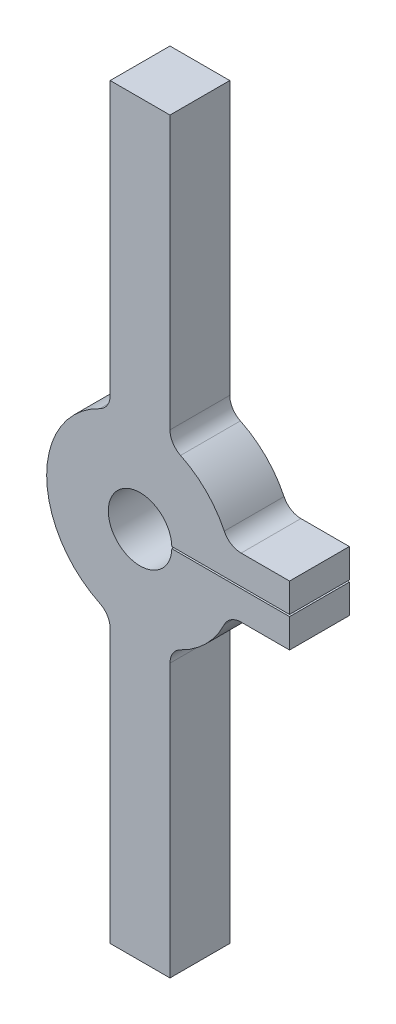
ISO-10303-21;
HEADER;
FILE_DESCRIPTION(('STEP AP214'),'2;1');
FILE_NAME('part.step','',(''),(''),'','','');
FILE_SCHEMA(('AUTOMOTIVE_DESIGN { 1 0 10303 214 1 1 1 1 }'));
ENDSEC;
DATA;
#1=APPLICATION_CONTEXT('core data for automotive mechanical design processes');
#2=APPLICATION_PROTOCOL_DEFINITION('international standard','automotive_design',2000,#1);
#3=PRODUCT_CONTEXT('',#1,'mechanical');
#4=PRODUCT('Part','Part','',(#3));
#5=PRODUCT_RELATED_PRODUCT_CATEGORY('part','',(#4));
#6=PRODUCT_DEFINITION_FORMATION('','',#4);
#7=PRODUCT_DEFINITION_CONTEXT('part definition',#1,'design');
#8=PRODUCT_DEFINITION('design','',#6,#7);
#9=PRODUCT_DEFINITION_SHAPE('','',#8);
#10=(LENGTH_UNIT() NAMED_UNIT(*) SI_UNIT(.MILLI.,.METRE.));
#11=(NAMED_UNIT(*) PLANE_ANGLE_UNIT() SI_UNIT($,.RADIAN.));
#12=(NAMED_UNIT(*) SI_UNIT($,.STERADIAN.) SOLID_ANGLE_UNIT());
#13=UNCERTAINTY_MEASURE_WITH_UNIT(LENGTH_MEASURE(1.E-05),#10,'distance_accuracy_value','');
#14=(GEOMETRIC_REPRESENTATION_CONTEXT(3) GLOBAL_UNCERTAINTY_ASSIGNED_CONTEXT((#13)) GLOBAL_UNIT_ASSIGNED_CONTEXT((#10,
#11,#12)) REPRESENTATION_CONTEXT('',''));
#15=CARTESIAN_POINT('',(0.,0.,0.));
#16=DIRECTION('',(0.,0.,1.));
#17=DIRECTION('',(1.,0.,0.));
#18=AXIS2_PLACEMENT_3D('',#15,#16,#17);
#19=CARTESIAN_POINT('',(40.,-8.,8.));
#20=DIRECTION('',(-1.,0.,0.));
#21=DIRECTION('',(0.,0.,1.));
#22=AXIS2_PLACEMENT_3D('',#19,#20,#21);
#23=PLANE('',#22);
#24=DIRECTION('',(0.,1.,0.));
#25=VECTOR('',#24,1.);
#26=CARTESIAN_POINT('',(40.,-8.,8.));
#27=LINE('',#26,#25);
#28=CARTESIAN_POINT('',(40.,0.25,8.));
#29=VERTEX_POINT('',#28);
#30=CARTESIAN_POINT('',(40.,8.,8.));
#31=VERTEX_POINT('',#30);
#32=EDGE_CURVE('E195',#29,#31,#27,.T.);
#33=ORIENTED_EDGE('',*,*,#32,.F.);
#34=DIRECTION('',(0.,0.,-1.));
#35=VECTOR('',#34,1.);
#36=CARTESIAN_POINT('',(40.,0.25,8.));
#37=LINE('',#36,#35);
#38=CARTESIAN_POINT('',(40.,0.25,-8.));
#39=VERTEX_POINT('',#38);
#40=EDGE_CURVE('E179',#29,#39,#37,.T.);
#41=ORIENTED_EDGE('',*,*,#40,.T.);
#42=DIRECTION('',(0.,1.,0.));
#43=VECTOR('',#42,1.);
#44=CARTESIAN_POINT('',(40.,-8.,-8.));
#45=LINE('',#44,#43);
#46=CARTESIAN_POINT('',(40.,8.,-8.));
#47=VERTEX_POINT('',#46);
#48=EDGE_CURVE('E217',#39,#47,#45,.T.);
#49=ORIENTED_EDGE('',*,*,#48,.T.);
#50=DIRECTION('',(0.,0.,-1.));
#51=VECTOR('',#50,1.);
#52=CARTESIAN_POINT('',(40.,8.,8.));
#53=LINE('',#52,#51);
#54=EDGE_CURVE('E203',#31,#47,#53,.T.);
#55=ORIENTED_EDGE('',*,*,#54,.F.);
#56=EDGE_LOOP('',(#33,#41,#49,#55));
#57=FACE_BOUND('',#56,.T.);
#58=ADVANCED_FACE('F32',(#57),#23,.F.);
#59=CARTESIAN_POINT('',(0.,0.,8.));
#60=DIRECTION('',(0.,0.,-1.));
#61=DIRECTION('',(-1.,0.,0.));
#62=AXIS2_PLACEMENT_3D('',#59,#60,#61);
#63=CYLINDRICAL_SURFACE('',#62,25.);
#64=CARTESIAN_POINT('',(0.,0.,-8.));
#65=DIRECTION('',(0.,0.,1.));
#66=DIRECTION('',(1.,0.,0.));
#67=AXIS2_PLACEMENT_3D('',#64,#65,#66);
#68=CIRCLE('',#67,25.);
#69=CARTESIAN_POINT('',(10.8333333333333,-22.5308430576596,-8.));
#70=VERTEX_POINT('',#69);
#71=CARTESIAN_POINT('',(22.5308430576596,-10.8333333333333,-8.));
#72=VERTEX_POINT('',#71);
#73=EDGE_CURVE('E280',#70,#72,#68,.T.);
#74=ORIENTED_EDGE('',*,*,#73,.T.);
#75=DIRECTION('',(0.,0.,-1.));
#76=VECTOR('',#75,1.);
#77=CARTESIAN_POINT('',(22.5308430576596,-10.8333333333333,8.));
#78=LINE('',#77,#76);
#79=CARTESIAN_POINT('',(22.5308430576596,-10.8333333333333,8.));
#80=VERTEX_POINT('',#79);
#81=EDGE_CURVE('E288',#72,#80,#78,.F.);
#82=ORIENTED_EDGE('',*,*,#81,.T.);
#83=CARTESIAN_POINT('',(0.,0.,8.));
#84=DIRECTION('',(0.,0.,1.));
#85=DIRECTION('',(1.,0.,0.));
#86=AXIS2_PLACEMENT_3D('',#83,#84,#85);
#87=CIRCLE('',#86,25.);
#88=CARTESIAN_POINT('',(10.8333333333333,-22.5308430576596,8.));
#89=VERTEX_POINT('',#88);
#90=EDGE_CURVE('E275',#89,#80,#87,.T.);
#91=ORIENTED_EDGE('',*,*,#90,.F.);
#92=DIRECTION('',(0.,0.,-1.));
#93=VECTOR('',#92,1.);
#94=CARTESIAN_POINT('',(10.8333333333333,-22.5308430576596,8.));
#95=LINE('',#94,#93);
#96=EDGE_CURVE('E285',#89,#70,#95,.T.);
#97=ORIENTED_EDGE('',*,*,#96,.T.);
#98=EDGE_LOOP('',(#74,#82,#91,#97));
#99=FACE_BOUND('',#98,.T.);
#100=ADVANCED_FACE('F367',(#99),#63,.T.);
#101=CARTESIAN_POINT('',(22.5308430576596,10.8333333333333,8.));
#102=VERTEX_POINT('',#101);
#103=CARTESIAN_POINT('',(10.8333333333333,22.5308430576596,8.));
#104=VERTEX_POINT('',#103);
#105=EDGE_CURVE('E273',#102,#104,#87,.T.);
#106=ORIENTED_EDGE('',*,*,#105,.F.);
#107=DIRECTION('',(0.,0.,-1.));
#108=VECTOR('',#107,1.);
#109=CARTESIAN_POINT('',(22.5308430576596,10.8333333333333,8.));
#110=LINE('',#109,#108);
#111=CARTESIAN_POINT('',(22.5308430576596,10.8333333333333,-8.));
#112=VERTEX_POINT('',#111);
#113=EDGE_CURVE('E304',#102,#112,#110,.T.);
#114=ORIENTED_EDGE('',*,*,#113,.T.);
#115=CARTESIAN_POINT('',(10.8333333333333,22.5308430576596,-8.));
#116=VERTEX_POINT('',#115);
#117=EDGE_CURVE('E270',#112,#116,#68,.T.);
#118=ORIENTED_EDGE('',*,*,#117,.T.);
#119=DIRECTION('',(0.,0.,-1.));
#120=VECTOR('',#119,1.);
#121=CARTESIAN_POINT('',(10.8333333333333,22.5308430576596,8.));
#122=LINE('',#121,#120);
#123=EDGE_CURVE('E302',#116,#104,#122,.F.);
#124=ORIENTED_EDGE('',*,*,#123,.T.);
#125=EDGE_LOOP('',(#106,#114,#118,#124));
#126=FACE_BOUND('',#125,.T.);
#127=ADVANCED_FACE('F337',(#126),#63,.T.);
#128=CARTESIAN_POINT('',(-10.8333333333333,22.5308430576596,-8.));
#129=VERTEX_POINT('',#128);
#130=CARTESIAN_POINT('',(-10.8333333333333,-22.5308430576596,-8.));
#131=VERTEX_POINT('',#130);
#132=EDGE_CURVE('E276',#129,#131,#68,.T.);
#133=ORIENTED_EDGE('',*,*,#132,.T.);
#134=DIRECTION('',(0.,0.,-1.));
#135=VECTOR('',#134,1.);
#136=CARTESIAN_POINT('',(-10.8333333333333,-22.5308430576596,8.));
#137=LINE('',#136,#135);
#138=CARTESIAN_POINT('',(-10.8333333333333,-22.5308430576596,8.));
#139=VERTEX_POINT('',#138);
#140=EDGE_CURVE('E296',#131,#139,#137,.F.);
#141=ORIENTED_EDGE('',*,*,#140,.T.);
#142=CARTESIAN_POINT('',(-10.8333333333333,22.5308430576596,8.));
#143=VERTEX_POINT('',#142);
#144=EDGE_CURVE('E277',#143,#139,#87,.T.);
#145=ORIENTED_EDGE('',*,*,#144,.F.);
#146=DIRECTION('',(0.,0.,-1.));
#147=VECTOR('',#146,1.);
#148=CARTESIAN_POINT('',(-10.8333333333333,22.5308430576596,8.));
#149=LINE('',#148,#147);
#150=EDGE_CURVE('E293',#143,#129,#149,.T.);
#151=ORIENTED_EDGE('',*,*,#150,.T.);
#152=EDGE_LOOP('',(#133,#141,#145,#151));
#153=FACE_BOUND('',#152,.T.);
#154=ADVANCED_FACE('F360',(#153),#63,.T.);
#155=CARTESIAN_POINT('',(0.,0.,8.));
#156=DIRECTION('',(0.,0.,1.));
#157=DIRECTION('',(1.,0.,0.));
#158=AXIS2_PLACEMENT_3D('',#155,#156,#157);
#159=PLANE('',#158);
#160=DIRECTION('',(-1.,0.,0.));
#161=VECTOR('',#160,1.);
#162=CARTESIAN_POINT('',(2.,0.25,8.));
#163=LINE('',#162,#161);
#164=CARTESIAN_POINT('',(8.49632273398321,0.25,8.));
#165=VERTEX_POINT('',#164);
#166=EDGE_CURVE('E182',#29,#165,#163,.T.);
#167=ORIENTED_EDGE('',*,*,#166,.F.);
#168=ORIENTED_EDGE('',*,*,#32,.T.);
#169=DIRECTION('',(-1.,0.,0.));
#170=VECTOR('',#169,1.);
#171=CARTESIAN_POINT('',(40.,8.,8.));
#172=LINE('',#171,#170);
#173=CARTESIAN_POINT('',(27.0370116691916,8.,8.));
#174=VERTEX_POINT('',#173);
#175=EDGE_CURVE('E209',#31,#174,#172,.T.);
#176=ORIENTED_EDGE('',*,*,#175,.T.);
#177=CARTESIAN_POINT('',(27.0370116691916,13.,8.));
#178=DIRECTION('',(0.,0.,1.));
#179=DIRECTION('',(1.,0.,0.));
#180=AXIS2_PLACEMENT_3D('',#177,#178,#179);
#181=CIRCLE('',#180,5.);
#182=EDGE_CURVE('E329',#174,#102,#181,.F.);
#183=ORIENTED_EDGE('',*,*,#182,.T.);
#184=ORIENTED_EDGE('',*,*,#105,.T.);
#185=CARTESIAN_POINT('',(13.,27.0370116691916,8.));
#186=DIRECTION('',(0.,0.,1.));
#187=DIRECTION('',(1.,0.,0.));
#188=AXIS2_PLACEMENT_3D('',#185,#186,#187);
#189=CIRCLE('',#188,5.);
#190=CARTESIAN_POINT('',(7.99999999999999,27.0370116691916,8.));
#191=VERTEX_POINT('',#190);
#192=EDGE_CURVE('E11',#104,#191,#189,.F.);
#193=ORIENTED_EDGE('',*,*,#192,.T.);
#194=DIRECTION('',(0.,1.,0.));
#195=VECTOR('',#194,1.);
#196=CARTESIAN_POINT('',(8.,100.,8.));
#197=LINE('',#196,#195);
#198=CARTESIAN_POINT('',(8.,100.,8.));
#199=VERTEX_POINT('',#198);
#200=EDGE_CURVE('E249',#191,#199,#197,.T.);
#201=ORIENTED_EDGE('',*,*,#200,.T.);
#202=DIRECTION('',(-1.,0.,0.));
#203=VECTOR('',#202,1.);
#204=CARTESIAN_POINT('',(-8.,100.,8.));
#205=LINE('',#204,#203);
#206=CARTESIAN_POINT('',(-8.,100.,8.));
#207=VERTEX_POINT('',#206);
#208=EDGE_CURVE('E251',#199,#207,#205,.T.);
#209=ORIENTED_EDGE('',*,*,#208,.T.);
#210=DIRECTION('',(0.,-1.,0.));
#211=VECTOR('',#210,1.);
#212=CARTESIAN_POINT('',(-8.,100.,8.));
#213=LINE('',#212,#211);
#214=CARTESIAN_POINT('',(-7.99999999999999,27.0370116691916,8.));
#215=VERTEX_POINT('',#214);
#216=EDGE_CURVE('E254',#207,#215,#213,.T.);
#217=ORIENTED_EDGE('',*,*,#216,.T.);
#218=CARTESIAN_POINT('',(-13.,27.0370116691916,8.));
#219=DIRECTION('',(0.,0.,1.));
#220=DIRECTION('',(1.,0.,0.));
#221=AXIS2_PLACEMENT_3D('',#218,#219,#220);
#222=CIRCLE('',#221,5.);
#223=EDGE_CURVE('E321',#215,#143,#222,.F.);
#224=ORIENTED_EDGE('',*,*,#223,.T.);
#225=ORIENTED_EDGE('',*,*,#144,.T.);
#226=CARTESIAN_POINT('',(-13.,-27.0370116691916,8.));
#227=DIRECTION('',(0.,0.,1.));
#228=DIRECTION('',(1.,0.,0.));
#229=AXIS2_PLACEMENT_3D('',#226,#227,#228);
#230=CIRCLE('',#229,5.);
#231=CARTESIAN_POINT('',(-8.,-27.0370116691916,8.));
#232=VERTEX_POINT('',#231);
#233=EDGE_CURVE('E317',#139,#232,#230,.F.);
#234=ORIENTED_EDGE('',*,*,#233,.T.);
#235=DIRECTION('',(0.,-1.,0.));
#236=VECTOR('',#235,1.);
#237=CARTESIAN_POINT('',(-7.99999999999999,-100.,8.));
#238=LINE('',#237,#236);
#239=CARTESIAN_POINT('',(-7.99999999999999,-100.,8.));
#240=VERTEX_POINT('',#239);
#241=EDGE_CURVE('E232',#232,#240,#238,.T.);
#242=ORIENTED_EDGE('',*,*,#241,.T.);
#243=DIRECTION('',(1.,0.,0.));
#244=VECTOR('',#243,1.);
#245=CARTESIAN_POINT('',(-7.99999999999999,-100.,8.));
#246=LINE('',#245,#244);
#247=CARTESIAN_POINT('',(8.00000000000001,-100.,8.));
#248=VERTEX_POINT('',#247);
#249=EDGE_CURVE('E235',#240,#248,#246,.T.);
#250=ORIENTED_EDGE('',*,*,#249,.T.);
#251=DIRECTION('',(0.,1.,0.));
#252=VECTOR('',#251,1.);
#253=CARTESIAN_POINT('',(8.00000000000001,-100.,8.));
#254=LINE('',#253,#252);
#255=CARTESIAN_POINT('',(8.00000000000001,-27.0370116691915,8.));
#256=VERTEX_POINT('',#255);
#257=EDGE_CURVE('E229',#248,#256,#254,.T.);
#258=ORIENTED_EDGE('',*,*,#257,.T.);
#259=CARTESIAN_POINT('',(13.,-27.0370116691916,8.));
#260=DIRECTION('',(0.,0.,1.));
#261=DIRECTION('',(1.,0.,0.));
#262=AXIS2_PLACEMENT_3D('',#259,#260,#261);
#263=CIRCLE('',#262,5.);
#264=EDGE_CURVE('E325',#256,#89,#263,.F.);
#265=ORIENTED_EDGE('',*,*,#264,.T.);
#266=ORIENTED_EDGE('',*,*,#90,.T.);
#267=CARTESIAN_POINT('',(27.0370116691916,-13.,8.));
#268=DIRECTION('',(0.,0.,1.));
#269=DIRECTION('',(1.,0.,0.));
#270=AXIS2_PLACEMENT_3D('',#267,#268,#269);
#271=CIRCLE('',#270,5.);
#272=CARTESIAN_POINT('',(27.0370116691916,-8.,8.));
#273=VERTEX_POINT('',#272);
#274=EDGE_CURVE('E313',#80,#273,#271,.F.);
#275=ORIENTED_EDGE('',*,*,#274,.T.);
#276=DIRECTION('',(1.,0.,0.));
#277=VECTOR('',#276,1.);
#278=CARTESIAN_POINT('',(40.,-8.,8.));
#279=LINE('',#278,#277);
#280=CARTESIAN_POINT('',(40.,-8.,8.));
#281=VERTEX_POINT('',#280);
#282=EDGE_CURVE('E206',#273,#281,#279,.T.);
#283=ORIENTED_EDGE('',*,*,#282,.T.);
#284=CARTESIAN_POINT('',(40.,-0.25,8.));
#285=VERTEX_POINT('',#284);
#286=EDGE_CURVE('E205',#281,#285,#27,.T.);
#287=ORIENTED_EDGE('',*,*,#286,.T.);
#288=DIRECTION('',(1.,0.,0.));
#289=VECTOR('',#288,1.);
#290=CARTESIAN_POINT('',(2.,-0.25,8.));
#291=LINE('',#290,#289);
#292=CARTESIAN_POINT('',(8.49632273398321,-0.25,8.));
#293=VERTEX_POINT('',#292);
#294=EDGE_CURVE('E200',#293,#285,#291,.T.);
#295=ORIENTED_EDGE('',*,*,#294,.F.);
#296=CARTESIAN_POINT('',(0.,0.,8.));
#297=DIRECTION('',(0.,0.,1.));
#298=DIRECTION('',(1.,0.,0.));
#299=AXIS2_PLACEMENT_3D('',#296,#297,#298);
#300=CIRCLE('',#299,8.5);
#301=EDGE_CURVE('E199',#165,#293,#300,.T.);
#302=ORIENTED_EDGE('',*,*,#301,.F.);
#303=EDGE_LOOP('',(#167,#168,#176,#183,#184,#193,#201,#209,#217,#224,#225,#234,#242,#250,#258,
#265,#266,#275,#283,#287,#295,#302));
#304=FACE_BOUND('',#303,.T.);
#305=ADVANCED_FACE('F193',(#304),#159,.T.);
#306=CARTESIAN_POINT('',(0.,0.,-8.));
#307=DIRECTION('',(0.,0.,1.));
#308=DIRECTION('',(1.,0.,0.));
#309=AXIS2_PLACEMENT_3D('',#306,#307,#308);
#310=PLANE('',#309);
#311=ORIENTED_EDGE('',*,*,#48,.F.);
#312=DIRECTION('',(-1.,0.,0.));
#313=VECTOR('',#312,1.);
#314=CARTESIAN_POINT('',(2.,0.25,-8.));
#315=LINE('',#314,#313);
#316=CARTESIAN_POINT('',(8.49632273398321,0.25,-8.));
#317=VERTEX_POINT('',#316);
#318=EDGE_CURVE('E185',#39,#317,#315,.T.);
#319=ORIENTED_EDGE('',*,*,#318,.T.);
#320=CARTESIAN_POINT('',(0.,0.,-8.));
#321=DIRECTION('',(0.,0.,1.));
#322=DIRECTION('',(1.,0.,0.));
#323=AXIS2_PLACEMENT_3D('',#320,#321,#322);
#324=CIRCLE('',#323,8.5);
#325=CARTESIAN_POINT('',(8.49632273398321,-0.25,-8.));
#326=VERTEX_POINT('',#325);
#327=EDGE_CURVE('E268',#317,#326,#324,.T.);
#328=ORIENTED_EDGE('',*,*,#327,.T.);
#329=DIRECTION('',(1.,0.,0.));
#330=VECTOR('',#329,1.);
#331=CARTESIAN_POINT('',(2.,-0.25,-8.));
#332=LINE('',#331,#330);
#333=CARTESIAN_POINT('',(40.,-0.25,-8.));
#334=VERTEX_POINT('',#333);
#335=EDGE_CURVE('E391',#326,#334,#332,.T.);
#336=ORIENTED_EDGE('',*,*,#335,.T.);
#337=CARTESIAN_POINT('',(40.,-8.,-8.));
#338=VERTEX_POINT('',#337);
#339=EDGE_CURVE('E219',#338,#334,#45,.T.);
#340=ORIENTED_EDGE('',*,*,#339,.F.);
#341=DIRECTION('',(1.,0.,0.));
#342=VECTOR('',#341,1.);
#343=CARTESIAN_POINT('',(40.,-8.,-8.));
#344=LINE('',#343,#342);
#345=CARTESIAN_POINT('',(27.0370116691916,-8.,-8.));
#346=VERTEX_POINT('',#345);
#347=EDGE_CURVE('E215',#346,#338,#344,.T.);
#348=ORIENTED_EDGE('',*,*,#347,.F.);
#349=CARTESIAN_POINT('',(27.0370116691916,-13.,-8.));
#350=DIRECTION('',(0.,0.,1.));
#351=DIRECTION('',(1.,0.,0.));
#352=AXIS2_PLACEMENT_3D('',#349,#350,#351);
#353=CIRCLE('',#352,5.);
#354=EDGE_CURVE('E311',#346,#72,#353,.T.);
#355=ORIENTED_EDGE('',*,*,#354,.T.);
#356=ORIENTED_EDGE('',*,*,#73,.F.);
#357=CARTESIAN_POINT('',(13.,-27.0370116691916,-8.));
#358=DIRECTION('',(0.,0.,1.));
#359=DIRECTION('',(1.,0.,0.));
#360=AXIS2_PLACEMENT_3D('',#357,#358,#359);
#361=CIRCLE('',#360,5.);
#362=CARTESIAN_POINT('',(8.00000000000001,-27.0370116691915,-8.));
#363=VERTEX_POINT('',#362);
#364=EDGE_CURVE('E323',#70,#363,#361,.T.);
#365=ORIENTED_EDGE('',*,*,#364,.T.);
#366=DIRECTION('',(0.,1.,0.));
#367=VECTOR('',#366,1.);
#368=CARTESIAN_POINT('',(8.00000000000001,-100.,-8.));
#369=LINE('',#368,#367);
#370=CARTESIAN_POINT('',(8.00000000000001,-100.,-8.));
#371=VERTEX_POINT('',#370);
#372=EDGE_CURVE('E228',#371,#363,#369,.T.);
#373=ORIENTED_EDGE('',*,*,#372,.F.);
#374=DIRECTION('',(1.,0.,0.));
#375=VECTOR('',#374,1.);
#376=CARTESIAN_POINT('',(-7.99999999999999,-100.,-8.));
#377=LINE('',#376,#375);
#378=CARTESIAN_POINT('',(-7.99999999999999,-100.,-8.));
#379=VERTEX_POINT('',#378);
#380=EDGE_CURVE('E233',#379,#371,#377,.T.);
#381=ORIENTED_EDGE('',*,*,#380,.F.);
#382=DIRECTION('',(0.,-1.,0.));
#383=VECTOR('',#382,1.);
#384=CARTESIAN_POINT('',(-7.99999999999999,-100.,-8.));
#385=LINE('',#384,#383);
#386=CARTESIAN_POINT('',(-8.,-27.0370116691916,-8.));
#387=VERTEX_POINT('',#386);
#388=EDGE_CURVE('E240',#387,#379,#385,.T.);
#389=ORIENTED_EDGE('',*,*,#388,.F.);
#390=CARTESIAN_POINT('',(-13.,-27.0370116691916,-8.));
#391=DIRECTION('',(0.,0.,1.));
#392=DIRECTION('',(1.,0.,0.));
#393=AXIS2_PLACEMENT_3D('',#390,#391,#392);
#394=CIRCLE('',#393,5.);
#395=EDGE_CURVE('E315',#387,#131,#394,.T.);
#396=ORIENTED_EDGE('',*,*,#395,.T.);
#397=ORIENTED_EDGE('',*,*,#132,.F.);
#398=CARTESIAN_POINT('',(-13.,27.0370116691916,-8.));
#399=DIRECTION('',(0.,0.,1.));
#400=DIRECTION('',(1.,0.,0.));
#401=AXIS2_PLACEMENT_3D('',#398,#399,#400);
#402=CIRCLE('',#401,5.);
#403=CARTESIAN_POINT('',(-7.99999999999999,27.0370116691916,-8.));
#404=VERTEX_POINT('',#403);
#405=EDGE_CURVE('E319',#129,#404,#402,.T.);
#406=ORIENTED_EDGE('',*,*,#405,.T.);
#407=DIRECTION('',(0.,-1.,0.));
#408=VECTOR('',#407,1.);
#409=CARTESIAN_POINT('',(-8.,100.,-8.));
#410=LINE('',#409,#408);
#411=CARTESIAN_POINT('',(-8.,100.,-8.));
#412=VERTEX_POINT('',#411);
#413=EDGE_CURVE('E252',#412,#404,#410,.T.);
#414=ORIENTED_EDGE('',*,*,#413,.F.);
#415=DIRECTION('',(-1.,0.,0.));
#416=VECTOR('',#415,1.);
#417=CARTESIAN_POINT('',(-8.,100.,-8.));
#418=LINE('',#417,#416);
#419=CARTESIAN_POINT('',(8.,100.,-8.));
#420=VERTEX_POINT('',#419);
#421=EDGE_CURVE('E259',#420,#412,#418,.T.);
#422=ORIENTED_EDGE('',*,*,#421,.F.);
#423=DIRECTION('',(0.,1.,0.));
#424=VECTOR('',#423,1.);
#425=CARTESIAN_POINT('',(8.,100.,-8.));
#426=LINE('',#425,#424);
#427=CARTESIAN_POINT('',(7.99999999999999,27.0370116691916,-8.));
#428=VERTEX_POINT('',#427);
#429=EDGE_CURVE('E248',#428,#420,#426,.T.);
#430=ORIENTED_EDGE('',*,*,#429,.F.);
#431=CARTESIAN_POINT('',(13.,27.0370116691916,-8.));
#432=DIRECTION('',(0.,0.,1.));
#433=DIRECTION('',(1.,0.,0.));
#434=AXIS2_PLACEMENT_3D('',#431,#432,#433);
#435=CIRCLE('',#434,5.);
#436=EDGE_CURVE('E40',#428,#116,#435,.T.);
#437=ORIENTED_EDGE('',*,*,#436,.T.);
#438=ORIENTED_EDGE('',*,*,#117,.F.);
#439=CARTESIAN_POINT('',(27.0370116691916,13.,-8.));
#440=DIRECTION('',(0.,0.,1.));
#441=DIRECTION('',(1.,0.,0.));
#442=AXIS2_PLACEMENT_3D('',#439,#440,#441);
#443=CIRCLE('',#442,5.);
#444=CARTESIAN_POINT('',(27.0370116691916,8.,-8.));
#445=VERTEX_POINT('',#444);
#446=EDGE_CURVE('E327',#112,#445,#443,.T.);
#447=ORIENTED_EDGE('',*,*,#446,.T.);
#448=DIRECTION('',(-1.,0.,0.));
#449=VECTOR('',#448,1.);
#450=CARTESIAN_POINT('',(40.,8.,-8.));
#451=LINE('',#450,#449);
#452=EDGE_CURVE('E210',#47,#445,#451,.T.);
#453=ORIENTED_EDGE('',*,*,#452,.F.);
#454=EDGE_LOOP('',(#311,#319,#328,#336,#340,#348,#355,#356,#365,#373,#381,#389,#396,#397,#406,
#414,#422,#430,#437,#438,#447,#453));
#455=FACE_BOUND('',#454,.T.);
#456=ADVANCED_FACE('F333',(#455),#310,.F.);
#457=CARTESIAN_POINT('',(0.,0.,8.));
#458=DIRECTION('',(0.,0.,-1.));
#459=DIRECTION('',(-1.,0.,0.));
#460=AXIS2_PLACEMENT_3D('',#457,#458,#459);
#461=CYLINDRICAL_SURFACE('',#460,8.5);
#462=DIRECTION('',(0.,0.,-1.));
#463=VECTOR('',#462,1.);
#464=CARTESIAN_POINT('',(8.49632273398321,0.25,8.));
#465=LINE('',#464,#463);
#466=EDGE_CURVE('E218',#165,#317,#465,.T.);
#467=ORIENTED_EDGE('',*,*,#466,.F.);
#468=ORIENTED_EDGE('',*,*,#301,.T.);
#469=DIRECTION('',(0.,0.,-1.));
#470=VECTOR('',#469,1.);
#471=CARTESIAN_POINT('',(8.49632273398321,-0.25,8.));
#472=LINE('',#471,#470);
#473=EDGE_CURVE('E390',#326,#293,#472,.F.);
#474=ORIENTED_EDGE('',*,*,#473,.F.);
#475=ORIENTED_EDGE('',*,*,#327,.F.);
#476=EDGE_LOOP('',(#467,#468,#474,#475));
#477=FACE_BOUND('',#476,.T.);
#478=ADVANCED_FACE('F388',(#477),#461,.F.);
#479=CARTESIAN_POINT('',(8.,100.,8.));
#480=DIRECTION('',(-1.,0.,0.));
#481=DIRECTION('',(0.,-1.,0.));
#482=AXIS2_PLACEMENT_3D('',#479,#480,#481);
#483=PLANE('',#482);
#484=ORIENTED_EDGE('',*,*,#200,.F.);
#485=DIRECTION('',(0.,0.,1.));
#486=VECTOR('',#485,1.);
#487=CARTESIAN_POINT('',(7.99999999999999,27.0370116691916,-8.));
#488=LINE('',#487,#486);
#489=EDGE_CURVE('E309',#191,#428,#488,.F.);
#490=ORIENTED_EDGE('',*,*,#489,.T.);
#491=ORIENTED_EDGE('',*,*,#429,.T.);
#492=DIRECTION('',(0.,0.,-1.));
#493=VECTOR('',#492,1.);
#494=CARTESIAN_POINT('',(8.,100.,8.));
#495=LINE('',#494,#493);
#496=EDGE_CURVE('E265',#199,#420,#495,.T.);
#497=ORIENTED_EDGE('',*,*,#496,.F.);
#498=EDGE_LOOP('',(#484,#490,#491,#497));
#499=FACE_BOUND('',#498,.T.);
#500=ADVANCED_FACE('F340',(#499),#483,.F.);
#501=CARTESIAN_POINT('',(-8.,100.,8.));
#502=DIRECTION('',(0.,-1.,0.));
#503=DIRECTION('',(0.,0.,-1.));
#504=AXIS2_PLACEMENT_3D('',#501,#502,#503);
#505=PLANE('',#504);
#506=ORIENTED_EDGE('',*,*,#421,.T.);
#507=DIRECTION('',(0.,0.,-1.));
#508=VECTOR('',#507,1.);
#509=CARTESIAN_POINT('',(-8.,100.,8.));
#510=LINE('',#509,#508);
#511=EDGE_CURVE('E257',#207,#412,#510,.T.);
#512=ORIENTED_EDGE('',*,*,#511,.F.);
#513=ORIENTED_EDGE('',*,*,#208,.F.);
#514=ORIENTED_EDGE('',*,*,#496,.T.);
#515=EDGE_LOOP('',(#506,#512,#513,#514));
#516=FACE_BOUND('',#515,.T.);
#517=ADVANCED_FACE('F345',(#516),#505,.F.);
#518=CARTESIAN_POINT('',(-8.,100.,8.));
#519=DIRECTION('',(1.,0.,0.));
#520=DIRECTION('',(0.,1.,0.));
#521=AXIS2_PLACEMENT_3D('',#518,#519,#520);
#522=PLANE('',#521);
#523=ORIENTED_EDGE('',*,*,#413,.T.);
#524=DIRECTION('',(0.,0.,1.));
#525=VECTOR('',#524,1.);
#526=CARTESIAN_POINT('',(-7.99999999999999,27.0370116691916,8.));
#527=LINE('',#526,#525);
#528=EDGE_CURVE('E298',#404,#215,#527,.T.);
#529=ORIENTED_EDGE('',*,*,#528,.T.);
#530=ORIENTED_EDGE('',*,*,#216,.F.);
#531=ORIENTED_EDGE('',*,*,#511,.T.);
#532=EDGE_LOOP('',(#523,#529,#530,#531));
#533=FACE_BOUND('',#532,.T.);
#534=ADVANCED_FACE('F349',(#533),#522,.F.);
#535=CARTESIAN_POINT('',(8.00000000000001,-100.,8.));
#536=DIRECTION('',(-1.,0.,0.));
#537=DIRECTION('',(0.,-1.,0.));
#538=AXIS2_PLACEMENT_3D('',#535,#536,#537);
#539=PLANE('',#538);
#540=ORIENTED_EDGE('',*,*,#372,.T.);
#541=DIRECTION('',(0.,0.,1.));
#542=VECTOR('',#541,1.);
#543=CARTESIAN_POINT('',(8.00000000000001,-27.0370116691916,8.));
#544=LINE('',#543,#542);
#545=EDGE_CURVE('E300',#363,#256,#544,.T.);
#546=ORIENTED_EDGE('',*,*,#545,.T.);
#547=ORIENTED_EDGE('',*,*,#257,.F.);
#548=DIRECTION('',(0.,0.,-1.));
#549=VECTOR('',#548,1.);
#550=CARTESIAN_POINT('',(8.00000000000001,-100.,8.));
#551=LINE('',#550,#549);
#552=EDGE_CURVE('E237',#248,#371,#551,.T.);
#553=ORIENTED_EDGE('',*,*,#552,.T.);
#554=EDGE_LOOP('',(#540,#546,#547,#553));
#555=FACE_BOUND('',#554,.T.);
#556=ADVANCED_FACE('F435',(#555),#539,.F.);
#557=CARTESIAN_POINT('',(-7.99999999999999,-100.,8.));
#558=DIRECTION('',(1.,0.,0.));
#559=DIRECTION('',(0.,1.,0.));
#560=AXIS2_PLACEMENT_3D('',#557,#558,#559);
#561=PLANE('',#560);
#562=ORIENTED_EDGE('',*,*,#241,.F.);
#563=DIRECTION('',(0.,0.,1.));
#564=VECTOR('',#563,1.);
#565=CARTESIAN_POINT('',(-8.,-27.0370116691916,-8.));
#566=LINE('',#565,#564);
#567=EDGE_CURVE('E290',#232,#387,#566,.F.);
#568=ORIENTED_EDGE('',*,*,#567,.T.);
#569=ORIENTED_EDGE('',*,*,#388,.T.);
#570=DIRECTION('',(0.,0.,-1.));
#571=VECTOR('',#570,1.);
#572=CARTESIAN_POINT('',(-7.99999999999999,-100.,8.));
#573=LINE('',#572,#571);
#574=EDGE_CURVE('E245',#240,#379,#573,.T.);
#575=ORIENTED_EDGE('',*,*,#574,.F.);
#576=EDGE_LOOP('',(#562,#568,#569,#575));
#577=FACE_BOUND('',#576,.T.);
#578=ADVANCED_FACE('F429',(#577),#561,.F.);
#579=CARTESIAN_POINT('',(-7.99999999999999,-100.,8.));
#580=DIRECTION('',(0.,1.,0.));
#581=DIRECTION('',(0.,0.,1.));
#582=AXIS2_PLACEMENT_3D('',#579,#580,#581);
#583=PLANE('',#582);
#584=ORIENTED_EDGE('',*,*,#380,.T.);
#585=ORIENTED_EDGE('',*,*,#552,.F.);
#586=ORIENTED_EDGE('',*,*,#249,.F.);
#587=ORIENTED_EDGE('',*,*,#574,.T.);
#588=EDGE_LOOP('',(#584,#585,#586,#587));
#589=FACE_BOUND('',#588,.T.);
#590=ADVANCED_FACE('F425',(#589),#583,.F.);
#591=CARTESIAN_POINT('',(40.,-8.,8.));
#592=DIRECTION('',(0.,1.,0.));
#593=DIRECTION('',(-1.,0.,0.));
#594=AXIS2_PLACEMENT_3D('',#591,#592,#593);
#595=PLANE('',#594);
#596=ORIENTED_EDGE('',*,*,#282,.F.);
#597=DIRECTION('',(0.,0.,1.));
#598=VECTOR('',#597,1.);
#599=CARTESIAN_POINT('',(27.0370116691916,-8.,-8.));
#600=LINE('',#599,#598);
#601=EDGE_CURVE('E189',#273,#346,#600,.F.);
#602=ORIENTED_EDGE('',*,*,#601,.T.);
#603=ORIENTED_EDGE('',*,*,#347,.T.);
#604=DIRECTION('',(0.,0.,-1.));
#605=VECTOR('',#604,1.);
#606=CARTESIAN_POINT('',(40.,-8.,8.));
#607=LINE('',#606,#605);
#608=EDGE_CURVE('E225',#281,#338,#607,.T.);
#609=ORIENTED_EDGE('',*,*,#608,.F.);
#610=EDGE_LOOP('',(#596,#602,#603,#609));
#611=FACE_BOUND('',#610,.T.);
#612=ADVANCED_FACE('F379',(#611),#595,.F.);
#613=ORIENTED_EDGE('',*,*,#339,.T.);
#614=DIRECTION('',(0.,0.,1.));
#615=VECTOR('',#614,1.);
#616=CARTESIAN_POINT('',(40.,-0.25,8.));
#617=LINE('',#616,#615);
#618=EDGE_CURVE('E190',#334,#285,#617,.T.);
#619=ORIENTED_EDGE('',*,*,#618,.T.);
#620=ORIENTED_EDGE('',*,*,#286,.F.);
#621=ORIENTED_EDGE('',*,*,#608,.T.);
#622=EDGE_LOOP('',(#613,#619,#620,#621));
#623=FACE_BOUND('',#622,.T.);
#624=ADVANCED_FACE('F383',(#623),#23,.F.);
#625=CARTESIAN_POINT('',(40.,8.,8.));
#626=DIRECTION('',(0.,-1.,0.));
#627=DIRECTION('',(1.,0.,0.));
#628=AXIS2_PLACEMENT_3D('',#625,#626,#627);
#629=PLANE('',#628);
#630=ORIENTED_EDGE('',*,*,#452,.T.);
#631=DIRECTION('',(0.,0.,1.));
#632=VECTOR('',#631,1.);
#633=CARTESIAN_POINT('',(27.0370116691916,8.,8.));
#634=LINE('',#633,#632);
#635=EDGE_CURVE('E307',#445,#174,#634,.T.);
#636=ORIENTED_EDGE('',*,*,#635,.T.);
#637=ORIENTED_EDGE('',*,*,#175,.F.);
#638=ORIENTED_EDGE('',*,*,#54,.T.);
#639=EDGE_LOOP('',(#630,#636,#637,#638));
#640=FACE_BOUND('',#639,.T.);
#641=ADVANCED_FACE('F398',(#640),#629,.F.);
#642=CARTESIAN_POINT('',(2.,-0.25,-8.));
#643=DIRECTION('',(0.,-1.,0.));
#644=DIRECTION('',(0.,0.,-1.));
#645=AXIS2_PLACEMENT_3D('',#642,#643,#644);
#646=PLANE('',#645);
#647=ORIENTED_EDGE('',*,*,#473,.T.);
#648=ORIENTED_EDGE('',*,*,#294,.T.);
#649=ORIENTED_EDGE('',*,*,#618,.F.);
#650=ORIENTED_EDGE('',*,*,#335,.F.);
#651=EDGE_LOOP('',(#647,#648,#649,#650));
#652=FACE_BOUND('',#651,.T.);
#653=ADVANCED_FACE('F424',(#652),#646,.F.);
#654=CARTESIAN_POINT('',(2.,0.25,-8.));
#655=DIRECTION('',(0.,1.,0.));
#656=DIRECTION('',(0.,0.,1.));
#657=AXIS2_PLACEMENT_3D('',#654,#655,#656);
#658=PLANE('',#657);
#659=ORIENTED_EDGE('',*,*,#466,.T.);
#660=ORIENTED_EDGE('',*,*,#318,.F.);
#661=ORIENTED_EDGE('',*,*,#40,.F.);
#662=ORIENTED_EDGE('',*,*,#166,.T.);
#663=EDGE_LOOP('',(#659,#660,#661,#662));
#664=FACE_BOUND('',#663,.T.);
#665=ADVANCED_FACE('F181',(#664),#658,.F.);
#666=CARTESIAN_POINT('',(27.0370116691916,-13.,8.));
#667=DIRECTION('',(0.,0.,-1.));
#668=DIRECTION('',(-1.,0.,0.));
#669=AXIS2_PLACEMENT_3D('',#666,#667,#668);
#670=CYLINDRICAL_SURFACE('',#669,5.);
#671=ORIENTED_EDGE('',*,*,#274,.F.);
#672=ORIENTED_EDGE('',*,*,#81,.F.);
#673=ORIENTED_EDGE('',*,*,#354,.F.);
#674=ORIENTED_EDGE('',*,*,#601,.F.);
#675=EDGE_LOOP('',(#671,#672,#673,#674));
#676=FACE_BOUND('',#675,.T.);
#677=ADVANCED_FACE('F373',(#676),#670,.F.);
#678=CARTESIAN_POINT('',(-13.,-27.0370116691916,8.));
#679=DIRECTION('',(0.,0.,-1.));
#680=DIRECTION('',(-1.,0.,0.));
#681=AXIS2_PLACEMENT_3D('',#678,#679,#680);
#682=CYLINDRICAL_SURFACE('',#681,5.);
#683=ORIENTED_EDGE('',*,*,#233,.F.);
#684=ORIENTED_EDGE('',*,*,#140,.F.);
#685=ORIENTED_EDGE('',*,*,#395,.F.);
#686=ORIENTED_EDGE('',*,*,#567,.F.);
#687=EDGE_LOOP('',(#683,#684,#685,#686));
#688=FACE_BOUND('',#687,.T.);
#689=ADVANCED_FACE('F454',(#688),#682,.F.);
#690=CARTESIAN_POINT('',(-13.,27.0370116691916,8.));
#691=DIRECTION('',(0.,0.,-1.));
#692=DIRECTION('',(-1.,0.,0.));
#693=AXIS2_PLACEMENT_3D('',#690,#691,#692);
#694=CYLINDRICAL_SURFACE('',#693,5.);
#695=ORIENTED_EDGE('',*,*,#223,.F.);
#696=ORIENTED_EDGE('',*,*,#528,.F.);
#697=ORIENTED_EDGE('',*,*,#405,.F.);
#698=ORIENTED_EDGE('',*,*,#150,.F.);
#699=EDGE_LOOP('',(#695,#696,#697,#698));
#700=FACE_BOUND('',#699,.T.);
#701=ADVANCED_FACE('F356',(#700),#694,.F.);
#702=CARTESIAN_POINT('',(13.,-27.0370116691916,8.));
#703=DIRECTION('',(0.,0.,-1.));
#704=DIRECTION('',(-1.,0.,0.));
#705=AXIS2_PLACEMENT_3D('',#702,#703,#704);
#706=CYLINDRICAL_SURFACE('',#705,5.);
#707=ORIENTED_EDGE('',*,*,#264,.F.);
#708=ORIENTED_EDGE('',*,*,#545,.F.);
#709=ORIENTED_EDGE('',*,*,#364,.F.);
#710=ORIENTED_EDGE('',*,*,#96,.F.);
#711=EDGE_LOOP('',(#707,#708,#709,#710));
#712=FACE_BOUND('',#711,.T.);
#713=ADVANCED_FACE('F404',(#712),#706,.F.);
#714=CARTESIAN_POINT('',(27.0370116691916,13.,8.));
#715=DIRECTION('',(0.,0.,-1.));
#716=DIRECTION('',(-1.,0.,0.));
#717=AXIS2_PLACEMENT_3D('',#714,#715,#716);
#718=CYLINDRICAL_SURFACE('',#717,5.);
#719=ORIENTED_EDGE('',*,*,#182,.F.);
#720=ORIENTED_EDGE('',*,*,#635,.F.);
#721=ORIENTED_EDGE('',*,*,#446,.F.);
#722=ORIENTED_EDGE('',*,*,#113,.F.);
#723=EDGE_LOOP('',(#719,#720,#721,#722));
#724=FACE_BOUND('',#723,.T.);
#725=ADVANCED_FACE('F402',(#724),#718,.F.);
#726=CARTESIAN_POINT('',(13.,27.0370116691916,8.));
#727=DIRECTION('',(0.,0.,-1.));
#728=DIRECTION('',(-1.,0.,0.));
#729=AXIS2_PLACEMENT_3D('',#726,#727,#728);
#730=CYLINDRICAL_SURFACE('',#729,5.);
#731=ORIENTED_EDGE('',*,*,#192,.F.);
#732=ORIENTED_EDGE('',*,*,#123,.F.);
#733=ORIENTED_EDGE('',*,*,#436,.F.);
#734=ORIENTED_EDGE('',*,*,#489,.F.);
#735=EDGE_LOOP('',(#731,#732,#733,#734));
#736=FACE_BOUND('',#735,.T.);
#737=ADVANCED_FACE('F34',(#736),#730,.F.);
#738=CLOSED_SHELL('',(#58,#100,#127,#154,#305,#456,#478,#500,#517,#534,#556,#578,#590,#612,#624,
#641,#653,#665,#677,#689,#701,#713,#725,#737));
#739=MANIFOLD_SOLID_BREP('B2',#738);
#740=ADVANCED_BREP_SHAPE_REPRESENTATION('',(#18,#739),#14);
#741=SHAPE_DEFINITION_REPRESENTATION(#9,#740);
ENDSEC;
END-ISO-10303-21;
